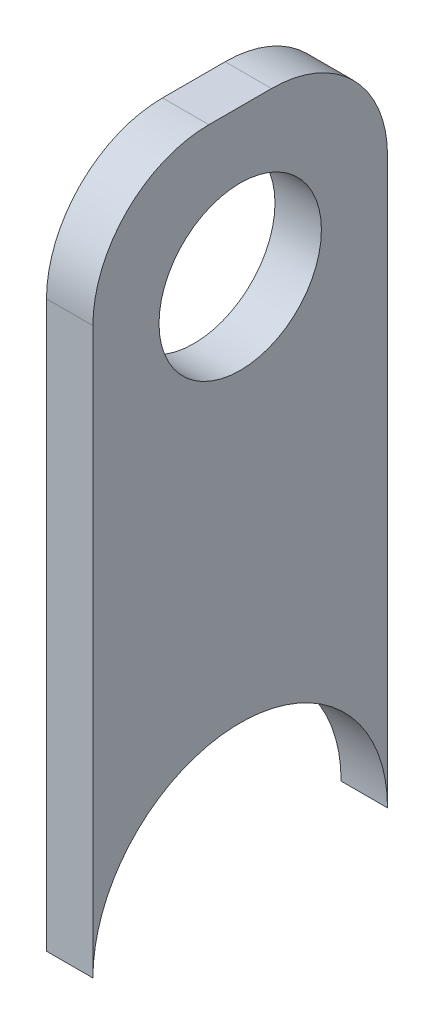
ISO-10303-21;
HEADER;
FILE_DESCRIPTION(('STEP AP214'),'2;1');
FILE_NAME('part.step','',(''),(''),'','','');
FILE_SCHEMA(('AUTOMOTIVE_DESIGN { 1 0 10303 214 1 1 1 1 }'));
ENDSEC;
DATA;
#1=APPLICATION_CONTEXT('core data for automotive mechanical design processes');
#2=APPLICATION_PROTOCOL_DEFINITION('international standard','automotive_design',2000,#1);
#3=PRODUCT_CONTEXT('',#1,'mechanical');
#4=PRODUCT('Part','Part','',(#3));
#5=PRODUCT_RELATED_PRODUCT_CATEGORY('part','',(#4));
#6=PRODUCT_DEFINITION_FORMATION('','',#4);
#7=PRODUCT_DEFINITION_CONTEXT('part definition',#1,'design');
#8=PRODUCT_DEFINITION('design','',#6,#7);
#9=PRODUCT_DEFINITION_SHAPE('','',#8);
#10=(LENGTH_UNIT() NAMED_UNIT(*) SI_UNIT(.MILLI.,.METRE.));
#11=(NAMED_UNIT(*) PLANE_ANGLE_UNIT() SI_UNIT($,.RADIAN.));
#12=(NAMED_UNIT(*) SI_UNIT($,.STERADIAN.) SOLID_ANGLE_UNIT());
#13=UNCERTAINTY_MEASURE_WITH_UNIT(LENGTH_MEASURE(1.E-05),#10,'distance_accuracy_value','');
#14=(GEOMETRIC_REPRESENTATION_CONTEXT(3) GLOBAL_UNCERTAINTY_ASSIGNED_CONTEXT((#13)) GLOBAL_UNIT_ASSIGNED_CONTEXT((#10,
#11,#12)) REPRESENTATION_CONTEXT('',''));
#15=CARTESIAN_POINT('',(0.,0.,0.));
#16=DIRECTION('',(0.,0.,1.));
#17=DIRECTION('',(1.,0.,0.));
#18=AXIS2_PLACEMENT_3D('',#15,#16,#17);
#19=CARTESIAN_POINT('',(4.,0.,0.));
#20=DIRECTION('',(1.,0.,0.));
#21=DIRECTION('',(0.,0.,-1.));
#22=AXIS2_PLACEMENT_3D('',#19,#20,#21);
#23=PLANE('',#22);
#24=CARTESIAN_POINT('',(4.,0.,0.));
#25=DIRECTION('',(-1.,0.,0.));
#26=DIRECTION('',(0.,0.,-1.));
#27=AXIS2_PLACEMENT_3D('',#24,#25,#26);
#28=CIRCLE('',#27,12.7);
#29=CARTESIAN_POINT('',(4.,0.,12.7));
#30=VERTEX_POINT('',#29);
#31=CARTESIAN_POINT('',(4.,0.,-12.7));
#32=VERTEX_POINT('',#31);
#33=EDGE_CURVE('E137',#30,#32,#28,.T.);
#34=ORIENTED_EDGE('',*,*,#33,.T.);
#35=DIRECTION('',(0.,1.,0.));
#36=VECTOR('',#35,1.);
#37=CARTESIAN_POINT('',(4.,0.,-12.7));
#38=LINE('',#37,#36);
#39=CARTESIAN_POINT('',(4.,48.7099999999999,-12.7));
#40=VERTEX_POINT('',#39);
#41=EDGE_CURVE('E95',#32,#40,#38,.T.);
#42=ORIENTED_EDGE('',*,*,#41,.T.);
#43=CARTESIAN_POINT('',(4.,48.71,-2.7));
#44=DIRECTION('',(1.,0.,0.));
#45=DIRECTION('',(0.,0.,1.));
#46=AXIS2_PLACEMENT_3D('',#43,#44,#45);
#47=CIRCLE('',#46,10.);
#48=CARTESIAN_POINT('',(4.,58.71,-2.69999999999993));
#49=VERTEX_POINT('',#48);
#50=EDGE_CURVE('E108',#40,#49,#47,.T.);
#51=ORIENTED_EDGE('',*,*,#50,.T.);
#52=DIRECTION('',(0.,0.,1.));
#53=VECTOR('',#52,1.);
#54=CARTESIAN_POINT('',(4.,58.71,-2.69999999999993));
#55=LINE('',#54,#53);
#56=CARTESIAN_POINT('',(4.,58.71,2.69999999999993));
#57=VERTEX_POINT('',#56);
#58=EDGE_CURVE('E102',#49,#57,#55,.T.);
#59=ORIENTED_EDGE('',*,*,#58,.T.);
#60=CARTESIAN_POINT('',(4.,48.71,2.7));
#61=DIRECTION('',(1.,0.,0.));
#62=DIRECTION('',(0.,0.,-1.));
#63=AXIS2_PLACEMENT_3D('',#60,#61,#62);
#64=CIRCLE('',#63,10.);
#65=CARTESIAN_POINT('',(4.,48.7099999999999,12.7));
#66=VERTEX_POINT('',#65);
#67=EDGE_CURVE('E106',#57,#66,#64,.T.);
#68=ORIENTED_EDGE('',*,*,#67,.T.);
#69=DIRECTION('',(0.,-1.,0.));
#70=VECTOR('',#69,1.);
#71=CARTESIAN_POINT('',(4.,0.,12.7));
#72=LINE('',#71,#70);
#73=EDGE_CURVE('E58',#66,#30,#72,.T.);
#74=ORIENTED_EDGE('',*,*,#73,.T.);
#75=EDGE_LOOP('',(#34,#42,#51,#59,#68,#74));
#76=FACE_BOUND('',#75,.T.);
#77=CARTESIAN_POINT('',(4.,46.01,0.));
#78=DIRECTION('',(1.,0.,0.));
#79=DIRECTION('',(0.,0.,-1.));
#80=AXIS2_PLACEMENT_3D('',#77,#78,#79);
#81=CIRCLE('',#80,7.);
#82=CARTESIAN_POINT('',(4.,46.01,-7.));
#83=VERTEX_POINT('',#82);
#84=EDGE_CURVE('E130',#83,#83,#81,.T.);
#85=ORIENTED_EDGE('',*,*,#84,.F.);
#86=EDGE_LOOP('',(#85));
#87=FACE_BOUND('',#86,.T.);
#88=ADVANCED_FACE('F41',(#76,#87),#23,.T.);
#89=CARTESIAN_POINT('',(0.,0.,0.));
#90=DIRECTION('',(1.,0.,0.));
#91=DIRECTION('',(0.,0.,-1.));
#92=AXIS2_PLACEMENT_3D('',#89,#90,#91);
#93=PLANE('',#92);
#94=CARTESIAN_POINT('',(0.,0.,0.));
#95=DIRECTION('',(-1.,0.,0.));
#96=DIRECTION('',(0.,0.,-1.));
#97=AXIS2_PLACEMENT_3D('',#94,#95,#96);
#98=CIRCLE('',#97,12.7);
#99=CARTESIAN_POINT('',(0.,0.,12.7));
#100=VERTEX_POINT('',#99);
#101=CARTESIAN_POINT('',(0.,0.,-12.7));
#102=VERTEX_POINT('',#101);
#103=EDGE_CURVE('E126',#100,#102,#98,.T.);
#104=ORIENTED_EDGE('',*,*,#103,.F.);
#105=DIRECTION('',(0.,-1.,0.));
#106=VECTOR('',#105,1.);
#107=CARTESIAN_POINT('',(0.,0.,12.7));
#108=LINE('',#107,#106);
#109=CARTESIAN_POINT('',(0.,48.7099999999999,12.7));
#110=VERTEX_POINT('',#109);
#111=EDGE_CURVE('E87',#110,#100,#108,.T.);
#112=ORIENTED_EDGE('',*,*,#111,.F.);
#113=CARTESIAN_POINT('',(0.,48.71,2.7));
#114=DIRECTION('',(1.,0.,0.));
#115=DIRECTION('',(0.,0.,-1.));
#116=AXIS2_PLACEMENT_3D('',#113,#114,#115);
#117=CIRCLE('',#116,10.);
#118=CARTESIAN_POINT('',(0.,58.71,2.69999999999993));
#119=VERTEX_POINT('',#118);
#120=EDGE_CURVE('E81',#119,#110,#117,.T.);
#121=ORIENTED_EDGE('',*,*,#120,.F.);
#122=DIRECTION('',(0.,0.,1.));
#123=VECTOR('',#122,1.);
#124=CARTESIAN_POINT('',(0.,58.71,-2.69999999999993));
#125=LINE('',#124,#123);
#126=CARTESIAN_POINT('',(0.,58.71,-2.69999999999993));
#127=VERTEX_POINT('',#126);
#128=EDGE_CURVE('E116',#127,#119,#125,.T.);
#129=ORIENTED_EDGE('',*,*,#128,.F.);
#130=CARTESIAN_POINT('',(0.,48.71,-2.7));
#131=DIRECTION('',(1.,0.,0.));
#132=DIRECTION('',(0.,0.,1.));
#133=AXIS2_PLACEMENT_3D('',#130,#131,#132);
#134=CIRCLE('',#133,10.);
#135=CARTESIAN_POINT('',(0.,48.7099999999999,-12.7));
#136=VERTEX_POINT('',#135);
#137=EDGE_CURVE('E132',#136,#127,#134,.T.);
#138=ORIENTED_EDGE('',*,*,#137,.F.);
#139=DIRECTION('',(0.,1.,0.));
#140=VECTOR('',#139,1.);
#141=CARTESIAN_POINT('',(0.,0.,-12.7));
#142=LINE('',#141,#140);
#143=EDGE_CURVE('E129',#102,#136,#142,.T.);
#144=ORIENTED_EDGE('',*,*,#143,.F.);
#145=EDGE_LOOP('',(#104,#112,#121,#129,#138,#144));
#146=FACE_BOUND('',#145,.T.);
#147=CARTESIAN_POINT('',(0.,46.01,0.));
#148=DIRECTION('',(1.,0.,0.));
#149=DIRECTION('',(0.,0.,-1.));
#150=AXIS2_PLACEMENT_3D('',#147,#148,#149);
#151=CIRCLE('',#150,7.);
#152=CARTESIAN_POINT('',(0.,46.01,-7.));
#153=VERTEX_POINT('',#152);
#154=EDGE_CURVE('E230',#153,#153,#151,.T.);
#155=ORIENTED_EDGE('',*,*,#154,.T.);
#156=EDGE_LOOP('',(#155));
#157=FACE_BOUND('',#156,.T.);
#158=ADVANCED_FACE('F146',(#146,#157),#93,.F.);
#159=CARTESIAN_POINT('',(4.,0.,0.));
#160=DIRECTION('',(-1.,0.,0.));
#161=DIRECTION('',(0.,0.,1.));
#162=AXIS2_PLACEMENT_3D('',#159,#160,#161);
#163=CYLINDRICAL_SURFACE('',#162,12.7);
#164=ORIENTED_EDGE('',*,*,#103,.T.);
#165=DIRECTION('',(-1.,0.,0.));
#166=VECTOR('',#165,1.);
#167=CARTESIAN_POINT('',(4.,0.,-12.7));
#168=LINE('',#167,#166);
#169=EDGE_CURVE('E11',#32,#102,#168,.T.);
#170=ORIENTED_EDGE('',*,*,#169,.F.);
#171=ORIENTED_EDGE('',*,*,#33,.F.);
#172=DIRECTION('',(-1.,0.,0.));
#173=VECTOR('',#172,1.);
#174=CARTESIAN_POINT('',(4.,0.,12.7));
#175=LINE('',#174,#173);
#176=EDGE_CURVE('E122',#30,#100,#175,.T.);
#177=ORIENTED_EDGE('',*,*,#176,.T.);
#178=EDGE_LOOP('',(#164,#170,#171,#177));
#179=FACE_BOUND('',#178,.T.);
#180=ADVANCED_FACE('F43',(#179),#163,.F.);
#181=CARTESIAN_POINT('',(4.,0.,-12.7));
#182=DIRECTION('',(0.,0.,1.));
#183=DIRECTION('',(1.,0.,0.));
#184=AXIS2_PLACEMENT_3D('',#181,#182,#183);
#185=PLANE('',#184);
#186=ORIENTED_EDGE('',*,*,#143,.T.);
#187=DIRECTION('',(-1.,0.,0.));
#188=VECTOR('',#187,1.);
#189=CARTESIAN_POINT('',(4.,48.7099999999999,-12.7));
#190=LINE('',#189,#188);
#191=EDGE_CURVE('E50',#40,#136,#190,.T.);
#192=ORIENTED_EDGE('',*,*,#191,.F.);
#193=ORIENTED_EDGE('',*,*,#41,.F.);
#194=ORIENTED_EDGE('',*,*,#169,.T.);
#195=EDGE_LOOP('',(#186,#192,#193,#194));
#196=FACE_BOUND('',#195,.T.);
#197=ADVANCED_FACE('F171',(#196),#185,.F.);
#198=CARTESIAN_POINT('',(4.,48.71,-2.7));
#199=DIRECTION('',(-1.,0.,0.));
#200=DIRECTION('',(0.,0.,1.));
#201=AXIS2_PLACEMENT_3D('',#198,#199,#200);
#202=CYLINDRICAL_SURFACE('',#201,10.);
#203=ORIENTED_EDGE('',*,*,#137,.T.);
#204=DIRECTION('',(-1.,0.,0.));
#205=VECTOR('',#204,1.);
#206=CARTESIAN_POINT('',(4.,58.71,-2.69999999999993));
#207=LINE('',#206,#205);
#208=EDGE_CURVE('E117',#49,#127,#207,.T.);
#209=ORIENTED_EDGE('',*,*,#208,.F.);
#210=ORIENTED_EDGE('',*,*,#50,.F.);
#211=ORIENTED_EDGE('',*,*,#191,.T.);
#212=EDGE_LOOP('',(#203,#209,#210,#211));
#213=FACE_BOUND('',#212,.T.);
#214=ADVANCED_FACE('F143',(#213),#202,.T.);
#215=CARTESIAN_POINT('',(4.,58.71,-2.69999999999993));
#216=DIRECTION('',(0.,-1.,0.));
#217=DIRECTION('',(0.,0.,-1.));
#218=AXIS2_PLACEMENT_3D('',#215,#216,#217);
#219=PLANE('',#218);
#220=ORIENTED_EDGE('',*,*,#128,.T.);
#221=DIRECTION('',(-1.,0.,0.));
#222=VECTOR('',#221,1.);
#223=CARTESIAN_POINT('',(4.,58.71,2.69999999999993));
#224=LINE('',#223,#222);
#225=EDGE_CURVE('E113',#57,#119,#224,.T.);
#226=ORIENTED_EDGE('',*,*,#225,.F.);
#227=ORIENTED_EDGE('',*,*,#58,.F.);
#228=ORIENTED_EDGE('',*,*,#208,.T.);
#229=EDGE_LOOP('',(#220,#226,#227,#228));
#230=FACE_BOUND('',#229,.T.);
#231=ADVANCED_FACE('F114',(#230),#219,.F.);
#232=CARTESIAN_POINT('',(4.,48.71,2.7));
#233=DIRECTION('',(-1.,0.,0.));
#234=DIRECTION('',(0.,0.,1.));
#235=AXIS2_PLACEMENT_3D('',#232,#233,#234);
#236=CYLINDRICAL_SURFACE('',#235,10.);
#237=ORIENTED_EDGE('',*,*,#120,.T.);
#238=DIRECTION('',(-1.,0.,0.));
#239=VECTOR('',#238,1.);
#240=CARTESIAN_POINT('',(4.,48.7099999999999,12.7));
#241=LINE('',#240,#239);
#242=EDGE_CURVE('E118',#66,#110,#241,.T.);
#243=ORIENTED_EDGE('',*,*,#242,.F.);
#244=ORIENTED_EDGE('',*,*,#67,.F.);
#245=ORIENTED_EDGE('',*,*,#225,.T.);
#246=EDGE_LOOP('',(#237,#243,#244,#245));
#247=FACE_BOUND('',#246,.T.);
#248=ADVANCED_FACE('F120',(#247),#236,.T.);
#249=CARTESIAN_POINT('',(4.,0.,12.7));
#250=DIRECTION('',(0.,0.,-1.));
#251=DIRECTION('',(-1.,0.,0.));
#252=AXIS2_PLACEMENT_3D('',#249,#250,#251);
#253=PLANE('',#252);
#254=ORIENTED_EDGE('',*,*,#111,.T.);
#255=ORIENTED_EDGE('',*,*,#176,.F.);
#256=ORIENTED_EDGE('',*,*,#73,.F.);
#257=ORIENTED_EDGE('',*,*,#242,.T.);
#258=EDGE_LOOP('',(#254,#255,#256,#257));
#259=FACE_BOUND('',#258,.T.);
#260=ADVANCED_FACE('F151',(#259),#253,.F.);
#261=CARTESIAN_POINT('',(4.,46.01,0.));
#262=DIRECTION('',(-1.,0.,0.));
#263=DIRECTION('',(0.,0.,1.));
#264=AXIS2_PLACEMENT_3D('',#261,#262,#263);
#265=CYLINDRICAL_SURFACE('',#264,7.);
#266=ORIENTED_EDGE('',*,*,#84,.T.);
#267=EDGE_LOOP('',(#266));
#268=FACE_BOUND('',#267,.T.);
#269=ORIENTED_EDGE('',*,*,#154,.F.);
#270=EDGE_LOOP('',(#269));
#271=FACE_BOUND('',#270,.T.);
#272=ADVANCED_FACE('F153',(#268,#271),#265,.F.);
#273=CLOSED_SHELL('',(#88,#158,#180,#197,#214,#231,#248,#260,#272));
#274=MANIFOLD_SOLID_BREP('B2',#273);
#275=ADVANCED_BREP_SHAPE_REPRESENTATION('',(#18,#274),#14);
#276=SHAPE_DEFINITION_REPRESENTATION(#9,#275);
ENDSEC;
END-ISO-10303-21;
